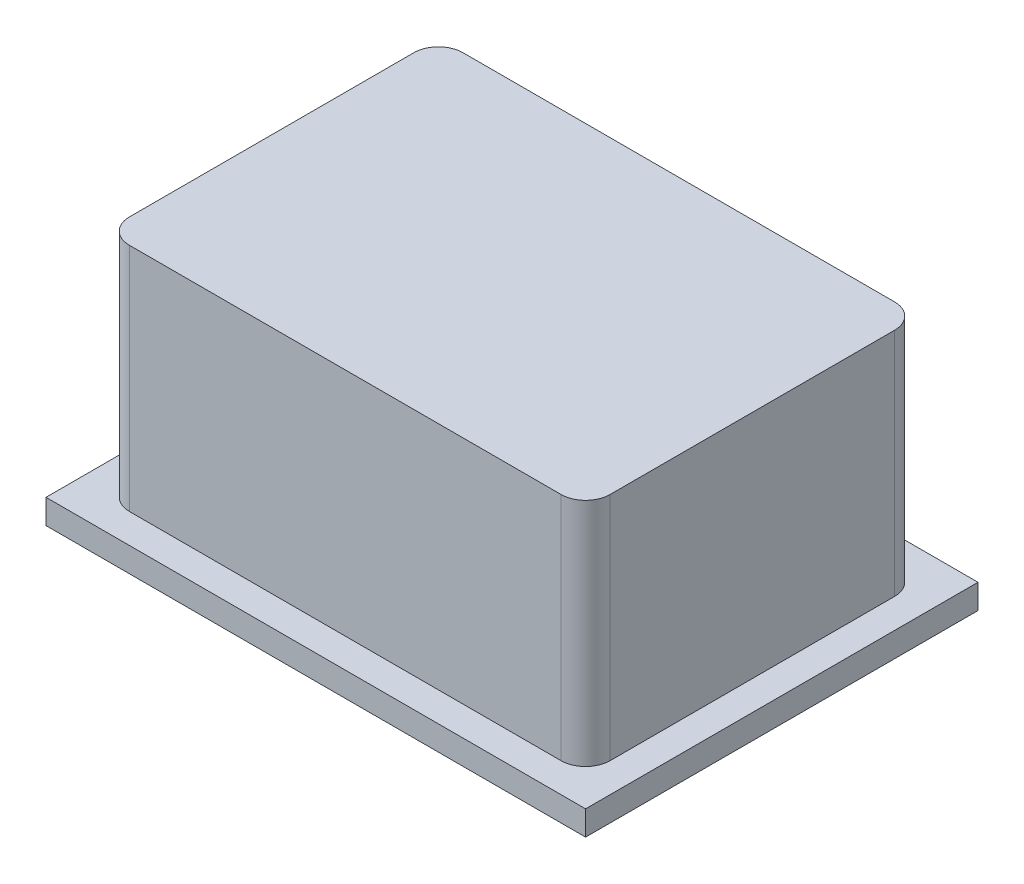
ISO-10303-21;
HEADER;
FILE_DESCRIPTION(('STEP AP214'),'2;1');
FILE_NAME('part.step','',(''),(''),'','','');
FILE_SCHEMA(('AUTOMOTIVE_DESIGN { 1 0 10303 214 1 1 1 1 }'));
ENDSEC;
DATA;
#1=APPLICATION_CONTEXT('core data for automotive mechanical design processes');
#2=APPLICATION_PROTOCOL_DEFINITION('international standard','automotive_design',2000,#1);
#3=PRODUCT_CONTEXT('',#1,'mechanical');
#4=PRODUCT('Part','Part','',(#3));
#5=PRODUCT_RELATED_PRODUCT_CATEGORY('part','',(#4));
#6=PRODUCT_DEFINITION_FORMATION('','',#4);
#7=PRODUCT_DEFINITION_CONTEXT('part definition',#1,'design');
#8=PRODUCT_DEFINITION('design','',#6,#7);
#9=PRODUCT_DEFINITION_SHAPE('','',#8);
#10=(LENGTH_UNIT() NAMED_UNIT(*) SI_UNIT(.MILLI.,.METRE.));
#11=(NAMED_UNIT(*) PLANE_ANGLE_UNIT() SI_UNIT($,.RADIAN.));
#12=(NAMED_UNIT(*) SI_UNIT($,.STERADIAN.) SOLID_ANGLE_UNIT());
#13=UNCERTAINTY_MEASURE_WITH_UNIT(LENGTH_MEASURE(1.E-05),#10,'distance_accuracy_value','');
#14=(GEOMETRIC_REPRESENTATION_CONTEXT(3) GLOBAL_UNCERTAINTY_ASSIGNED_CONTEXT((#13)) GLOBAL_UNIT_ASSIGNED_CONTEXT((#10,
#11,#12)) REPRESENTATION_CONTEXT('',''));
#15=CARTESIAN_POINT('',(0.,0.,0.));
#16=DIRECTION('',(0.,0.,1.));
#17=DIRECTION('',(1.,0.,0.));
#18=AXIS2_PLACEMENT_3D('',#15,#16,#17);
#19=CARTESIAN_POINT('',(0.,4.7,0.));
#20=DIRECTION('',(1.,0.,0.));
#21=DIRECTION('',(0.,0.,-1.));
#22=AXIS2_PLACEMENT_3D('',#19,#20,#21);
#23=PLANE('',#22);
#24=DIRECTION('',(0.,0.,1.));
#25=VECTOR('',#24,1.);
#26=CARTESIAN_POINT('',(0.,4.7,0.));
#27=LINE('',#26,#25);
#28=CARTESIAN_POINT('',(0.,4.7,-6.3));
#29=VERTEX_POINT('',#28);
#30=CARTESIAN_POINT('',(0.,4.7,-0.5));
#31=VERTEX_POINT('',#30);
#32=EDGE_CURVE('E223',#29,#31,#27,.T.);
#33=ORIENTED_EDGE('',*,*,#32,.F.);
#34=DIRECTION('',(0.,-1.,0.));
#35=VECTOR('',#34,1.);
#36=CARTESIAN_POINT('',(0.,4.7,-6.3));
#37=LINE('',#36,#35);
#38=CARTESIAN_POINT('',(0.,0.,-6.3));
#39=VERTEX_POINT('',#38);
#40=EDGE_CURVE('E269',#29,#39,#37,.T.);
#41=ORIENTED_EDGE('',*,*,#40,.T.);
#42=DIRECTION('',(0.,0.,1.));
#43=VECTOR('',#42,1.);
#44=CARTESIAN_POINT('',(0.,0.,0.));
#45=LINE('',#44,#43);
#46=CARTESIAN_POINT('',(0.,0.,-0.5));
#47=VERTEX_POINT('',#46);
#48=EDGE_CURVE('E225',#39,#47,#45,.T.);
#49=ORIENTED_EDGE('',*,*,#48,.T.);
#50=DIRECTION('',(0.,-1.,0.));
#51=VECTOR('',#50,1.);
#52=CARTESIAN_POINT('',(0.,4.7,-0.5));
#53=LINE('',#52,#51);
#54=EDGE_CURVE('E265',#47,#31,#53,.F.);
#55=ORIENTED_EDGE('',*,*,#54,.T.);
#56=EDGE_LOOP('',(#33,#41,#49,#55));
#57=FACE_BOUND('',#56,.T.);
#58=ADVANCED_FACE('F39',(#57),#23,.F.);
#59=CARTESIAN_POINT('',(0.,4.7,0.));
#60=DIRECTION('',(0.,0.,-1.));
#61=DIRECTION('',(-1.,0.,0.));
#62=AXIS2_PLACEMENT_3D('',#59,#60,#61);
#63=PLANE('',#62);
#64=DIRECTION('',(1.,0.,0.));
#65=VECTOR('',#64,1.);
#66=CARTESIAN_POINT('',(0.,0.,0.));
#67=LINE('',#66,#65);
#68=CARTESIAN_POINT('',(0.5,0.,0.));
#69=VERTEX_POINT('',#68);
#70=CARTESIAN_POINT('',(9.3,0.,0.));
#71=VERTEX_POINT('',#70);
#72=EDGE_CURVE('E239',#69,#71,#67,.T.);
#73=ORIENTED_EDGE('',*,*,#72,.T.);
#74=DIRECTION('',(0.,-1.,0.));
#75=VECTOR('',#74,1.);
#76=CARTESIAN_POINT('',(9.3,4.7,0.));
#77=LINE('',#76,#75);
#78=CARTESIAN_POINT('',(9.3,4.7,0.));
#79=VERTEX_POINT('',#78);
#80=EDGE_CURVE('E272',#71,#79,#77,.F.);
#81=ORIENTED_EDGE('',*,*,#80,.T.);
#82=DIRECTION('',(1.,0.,0.));
#83=VECTOR('',#82,1.);
#84=CARTESIAN_POINT('',(0.,4.7,0.));
#85=LINE('',#84,#83);
#86=CARTESIAN_POINT('',(0.5,4.7,0.));
#87=VERTEX_POINT('',#86);
#88=EDGE_CURVE('E227',#87,#79,#85,.T.);
#89=ORIENTED_EDGE('',*,*,#88,.F.);
#90=DIRECTION('',(0.,-1.,0.));
#91=VECTOR('',#90,1.);
#92=CARTESIAN_POINT('',(0.5,4.7,0.));
#93=LINE('',#92,#91);
#94=EDGE_CURVE('E268',#87,#69,#93,.T.);
#95=ORIENTED_EDGE('',*,*,#94,.T.);
#96=EDGE_LOOP('',(#73,#81,#89,#95));
#97=FACE_BOUND('',#96,.T.);
#98=ADVANCED_FACE('F300',(#97),#63,.F.);
#99=CARTESIAN_POINT('',(9.8,4.7,0.));
#100=DIRECTION('',(-1.,0.,0.));
#101=DIRECTION('',(0.,0.,1.));
#102=AXIS2_PLACEMENT_3D('',#99,#100,#101);
#103=PLANE('',#102);
#104=DIRECTION('',(0.,0.,-1.));
#105=VECTOR('',#104,1.);
#106=CARTESIAN_POINT('',(9.8,0.,0.));
#107=LINE('',#106,#105);
#108=CARTESIAN_POINT('',(9.8,0.,-0.5));
#109=VERTEX_POINT('',#108);
#110=CARTESIAN_POINT('',(9.8,0.,-6.3));
#111=VERTEX_POINT('',#110);
#112=EDGE_CURVE('E245',#109,#111,#107,.T.);
#113=ORIENTED_EDGE('',*,*,#112,.T.);
#114=DIRECTION('',(0.,-1.,0.));
#115=VECTOR('',#114,1.);
#116=CARTESIAN_POINT('',(9.8,4.7,-6.3));
#117=LINE('',#116,#115);
#118=CARTESIAN_POINT('',(9.8,4.7,-6.3));
#119=VERTEX_POINT('',#118);
#120=EDGE_CURVE('E251',#111,#119,#117,.F.);
#121=ORIENTED_EDGE('',*,*,#120,.T.);
#122=DIRECTION('',(0.,0.,-1.));
#123=VECTOR('',#122,1.);
#124=CARTESIAN_POINT('',(9.8,4.7,0.));
#125=LINE('',#124,#123);
#126=CARTESIAN_POINT('',(9.8,4.7,-0.5));
#127=VERTEX_POINT('',#126);
#128=EDGE_CURVE('E233',#127,#119,#125,.T.);
#129=ORIENTED_EDGE('',*,*,#128,.F.);
#130=DIRECTION('',(0.,-1.,0.));
#131=VECTOR('',#130,1.);
#132=CARTESIAN_POINT('',(9.8,4.7,-0.5));
#133=LINE('',#132,#131);
#134=EDGE_CURVE('E252',#127,#109,#133,.T.);
#135=ORIENTED_EDGE('',*,*,#134,.T.);
#136=EDGE_LOOP('',(#113,#121,#129,#135));
#137=FACE_BOUND('',#136,.T.);
#138=ADVANCED_FACE('F304',(#137),#103,.F.);
#139=CARTESIAN_POINT('',(0.,4.7,-6.8));
#140=DIRECTION('',(0.,0.,1.));
#141=DIRECTION('',(1.,0.,0.));
#142=AXIS2_PLACEMENT_3D('',#139,#140,#141);
#143=PLANE('',#142);
#144=DIRECTION('',(-1.,0.,0.));
#145=VECTOR('',#144,1.);
#146=CARTESIAN_POINT('',(0.,4.7,-6.8));
#147=LINE('',#146,#145);
#148=CARTESIAN_POINT('',(9.3,4.7,-6.8));
#149=VERTEX_POINT('',#148);
#150=CARTESIAN_POINT('',(0.5,4.7,-6.8));
#151=VERTEX_POINT('',#150);
#152=EDGE_CURVE('E234',#149,#151,#147,.T.);
#153=ORIENTED_EDGE('',*,*,#152,.F.);
#154=DIRECTION('',(0.,-1.,0.));
#155=VECTOR('',#154,1.);
#156=CARTESIAN_POINT('',(9.3,4.7,-6.8));
#157=LINE('',#156,#155);
#158=CARTESIAN_POINT('',(9.3,0.,-6.8));
#159=VERTEX_POINT('',#158);
#160=EDGE_CURVE('E247',#149,#159,#157,.T.);
#161=ORIENTED_EDGE('',*,*,#160,.T.);
#162=DIRECTION('',(-1.,0.,0.));
#163=VECTOR('',#162,1.);
#164=CARTESIAN_POINT('',(0.,0.,-6.8));
#165=LINE('',#164,#163);
#166=CARTESIAN_POINT('',(0.5,0.,-6.8));
#167=VERTEX_POINT('',#166);
#168=EDGE_CURVE('E226',#159,#167,#165,.T.);
#169=ORIENTED_EDGE('',*,*,#168,.T.);
#170=DIRECTION('',(0.,-1.,0.));
#171=VECTOR('',#170,1.);
#172=CARTESIAN_POINT('',(0.5,4.7,-6.8));
#173=LINE('',#172,#171);
#174=EDGE_CURVE('E240',#167,#151,#173,.F.);
#175=ORIENTED_EDGE('',*,*,#174,.T.);
#176=EDGE_LOOP('',(#153,#161,#169,#175));
#177=FACE_BOUND('',#176,.T.);
#178=ADVANCED_FACE('F281',(#177),#143,.F.);
#179=CARTESIAN_POINT('',(0.,4.7,0.));
#180=DIRECTION('',(0.,-1.,0.));
#181=DIRECTION('',(0.,0.,-1.));
#182=AXIS2_PLACEMENT_3D('',#179,#180,#181);
#183=PLANE('',#182);
#184=ORIENTED_EDGE('',*,*,#128,.T.);
#185=CARTESIAN_POINT('',(9.3,4.7,-6.3));
#186=DIRECTION('',(0.,-1.,0.));
#187=DIRECTION('',(0.,0.,-1.));
#188=AXIS2_PLACEMENT_3D('',#185,#186,#187);
#189=CIRCLE('',#188,0.5);
#190=EDGE_CURVE('E264',#119,#149,#189,.F.);
#191=ORIENTED_EDGE('',*,*,#190,.T.);
#192=ORIENTED_EDGE('',*,*,#152,.T.);
#193=CARTESIAN_POINT('',(0.5,4.7,-6.3));
#194=DIRECTION('',(0.,-1.,0.));
#195=DIRECTION('',(0.,0.,-1.));
#196=AXIS2_PLACEMENT_3D('',#193,#194,#195);
#197=CIRCLE('',#196,0.5);
#198=EDGE_CURVE('E258',#151,#29,#197,.F.);
#199=ORIENTED_EDGE('',*,*,#198,.T.);
#200=ORIENTED_EDGE('',*,*,#32,.T.);
#201=CARTESIAN_POINT('',(0.5,4.7,-0.5));
#202=DIRECTION('',(0.,-1.,0.));
#203=DIRECTION('',(0.,0.,-1.));
#204=AXIS2_PLACEMENT_3D('',#201,#202,#203);
#205=CIRCLE('',#204,0.5);
#206=EDGE_CURVE('E257',#31,#87,#205,.F.);
#207=ORIENTED_EDGE('',*,*,#206,.T.);
#208=ORIENTED_EDGE('',*,*,#88,.T.);
#209=CARTESIAN_POINT('',(9.3,4.7,-0.5));
#210=DIRECTION('',(0.,-1.,0.));
#211=DIRECTION('',(0.,0.,-1.));
#212=AXIS2_PLACEMENT_3D('',#209,#210,#211);
#213=CIRCLE('',#212,0.5);
#214=EDGE_CURVE('E259',#79,#127,#213,.F.);
#215=ORIENTED_EDGE('',*,*,#214,.T.);
#216=EDGE_LOOP('',(#184,#191,#192,#199,#200,#207,#208,#215));
#217=FACE_BOUND('',#216,.T.);
#218=ADVANCED_FACE('F293',(#217),#183,.F.);
#219=CARTESIAN_POINT('',(10.4,-0.5,0.6));
#220=DIRECTION('',(0.,0.,-1.));
#221=DIRECTION('',(-1.,0.,0.));
#222=AXIS2_PLACEMENT_3D('',#219,#220,#221);
#223=PLANE('',#222);
#224=DIRECTION('',(-1.,0.,0.));
#225=VECTOR('',#224,1.);
#226=CARTESIAN_POINT('',(10.4,0.,0.6));
#227=LINE('',#226,#225);
#228=CARTESIAN_POINT('',(10.4,0.,0.6));
#229=VERTEX_POINT('',#228);
#230=CARTESIAN_POINT('',(-0.6,0.,0.6));
#231=VERTEX_POINT('',#230);
#232=EDGE_CURVE('E188',#229,#231,#227,.T.);
#233=ORIENTED_EDGE('',*,*,#232,.T.);
#234=DIRECTION('',(0.,1.,0.));
#235=VECTOR('',#234,1.);
#236=CARTESIAN_POINT('',(-0.6,-0.5,0.6));
#237=LINE('',#236,#235);
#238=CARTESIAN_POINT('',(-0.6,-0.5,0.6));
#239=VERTEX_POINT('',#238);
#240=EDGE_CURVE('E216',#239,#231,#237,.T.);
#241=ORIENTED_EDGE('',*,*,#240,.F.);
#242=DIRECTION('',(-1.,0.,0.));
#243=VECTOR('',#242,1.);
#244=CARTESIAN_POINT('',(10.4,-0.5,0.6));
#245=LINE('',#244,#243);
#246=CARTESIAN_POINT('',(10.4,-0.5,0.6));
#247=VERTEX_POINT('',#246);
#248=EDGE_CURVE('E191',#247,#239,#245,.T.);
#249=ORIENTED_EDGE('',*,*,#248,.F.);
#250=DIRECTION('',(0.,1.,0.));
#251=VECTOR('',#250,1.);
#252=CARTESIAN_POINT('',(10.4,-0.5,0.6));
#253=LINE('',#252,#251);
#254=EDGE_CURVE('E203',#247,#229,#253,.T.);
#255=ORIENTED_EDGE('',*,*,#254,.T.);
#256=EDGE_LOOP('',(#233,#241,#249,#255));
#257=FACE_BOUND('',#256,.T.);
#258=ADVANCED_FACE('F334',(#257),#223,.F.);
#259=CARTESIAN_POINT('',(-0.6,-0.5,0.6));
#260=DIRECTION('',(1.,0.,0.));
#261=DIRECTION('',(0.,0.,-1.));
#262=AXIS2_PLACEMENT_3D('',#259,#260,#261);
#263=PLANE('',#262);
#264=DIRECTION('',(0.,0.,-1.));
#265=VECTOR('',#264,1.);
#266=CARTESIAN_POINT('',(-0.6,0.,0.6));
#267=LINE('',#266,#265);
#268=CARTESIAN_POINT('',(-0.6,0.,-7.4));
#269=VERTEX_POINT('',#268);
#270=EDGE_CURVE('E210',#231,#269,#267,.T.);
#271=ORIENTED_EDGE('',*,*,#270,.T.);
#272=DIRECTION('',(0.,1.,0.));
#273=VECTOR('',#272,1.);
#274=CARTESIAN_POINT('',(-0.6,-0.5,-7.4));
#275=LINE('',#274,#273);
#276=CARTESIAN_POINT('',(-0.6,-0.5,-7.4));
#277=VERTEX_POINT('',#276);
#278=EDGE_CURVE('E219',#277,#269,#275,.T.);
#279=ORIENTED_EDGE('',*,*,#278,.F.);
#280=DIRECTION('',(0.,0.,-1.));
#281=VECTOR('',#280,1.);
#282=CARTESIAN_POINT('',(-0.6,-0.5,0.6));
#283=LINE('',#282,#281);
#284=EDGE_CURVE('E199',#239,#277,#283,.T.);
#285=ORIENTED_EDGE('',*,*,#284,.F.);
#286=ORIENTED_EDGE('',*,*,#240,.T.);
#287=EDGE_LOOP('',(#271,#279,#285,#286));
#288=FACE_BOUND('',#287,.T.);
#289=ADVANCED_FACE('F333',(#288),#263,.F.);
#290=CARTESIAN_POINT('',(-0.6,-0.5,-7.4));
#291=DIRECTION('',(0.,0.,1.));
#292=DIRECTION('',(1.,0.,0.));
#293=AXIS2_PLACEMENT_3D('',#290,#291,#292);
#294=PLANE('',#293);
#295=DIRECTION('',(1.,0.,0.));
#296=VECTOR('',#295,1.);
#297=CARTESIAN_POINT('',(-0.6,0.,-7.4));
#298=LINE('',#297,#296);
#299=CARTESIAN_POINT('',(10.4,0.,-7.4));
#300=VERTEX_POINT('',#299);
#301=EDGE_CURVE('E209',#269,#300,#298,.T.);
#302=ORIENTED_EDGE('',*,*,#301,.T.);
#303=DIRECTION('',(0.,1.,0.));
#304=VECTOR('',#303,1.);
#305=CARTESIAN_POINT('',(10.4,-0.5,-7.4));
#306=LINE('',#305,#304);
#307=CARTESIAN_POINT('',(10.4,-0.5,-7.4));
#308=VERTEX_POINT('',#307);
#309=EDGE_CURVE('E211',#308,#300,#306,.T.);
#310=ORIENTED_EDGE('',*,*,#309,.F.);
#311=DIRECTION('',(1.,0.,0.));
#312=VECTOR('',#311,1.);
#313=CARTESIAN_POINT('',(-0.6,-0.5,-7.4));
#314=LINE('',#313,#312);
#315=EDGE_CURVE('E196',#277,#308,#314,.T.);
#316=ORIENTED_EDGE('',*,*,#315,.F.);
#317=ORIENTED_EDGE('',*,*,#278,.T.);
#318=EDGE_LOOP('',(#302,#310,#316,#317));
#319=FACE_BOUND('',#318,.T.);
#320=ADVANCED_FACE('F336',(#319),#294,.F.);
#321=CARTESIAN_POINT('',(10.4,-0.5,-7.4));
#322=DIRECTION('',(-1.,0.,0.));
#323=DIRECTION('',(0.,0.,1.));
#324=AXIS2_PLACEMENT_3D('',#321,#322,#323);
#325=PLANE('',#324);
#326=DIRECTION('',(0.,0.,1.));
#327=VECTOR('',#326,1.);
#328=CARTESIAN_POINT('',(10.4,0.,-7.4));
#329=LINE('',#328,#327);
#330=EDGE_CURVE('E197',#300,#229,#329,.T.);
#331=ORIENTED_EDGE('',*,*,#330,.T.);
#332=ORIENTED_EDGE('',*,*,#254,.F.);
#333=DIRECTION('',(0.,0.,1.));
#334=VECTOR('',#333,1.);
#335=CARTESIAN_POINT('',(10.4,-0.5,-7.4));
#336=LINE('',#335,#334);
#337=EDGE_CURVE('E201',#308,#247,#336,.T.);
#338=ORIENTED_EDGE('',*,*,#337,.F.);
#339=ORIENTED_EDGE('',*,*,#309,.T.);
#340=EDGE_LOOP('',(#331,#332,#338,#339));
#341=FACE_BOUND('',#340,.T.);
#342=ADVANCED_FACE('F345',(#341),#325,.F.);
#343=CARTESIAN_POINT('',(0.,-0.5,0.));
#344=DIRECTION('',(0.,-1.,0.));
#345=DIRECTION('',(0.,0.,-1.));
#346=AXIS2_PLACEMENT_3D('',#343,#344,#345);
#347=PLANE('',#346);
#348=DIRECTION('',(0.,0.,1.));
#349=VECTOR('',#348,1.);
#350=CARTESIAN_POINT('',(8.9,-0.5,-5.9));
#351=LINE('',#350,#349);
#352=CARTESIAN_POINT('',(8.9,-0.5,-5.9));
#353=VERTEX_POINT('',#352);
#354=CARTESIAN_POINT('',(8.9,-0.5,-0.9));
#355=VERTEX_POINT('',#354);
#356=EDGE_CURVE('E160',#353,#355,#351,.T.);
#357=ORIENTED_EDGE('',*,*,#356,.F.);
#358=DIRECTION('',(1.,0.,0.));
#359=VECTOR('',#358,1.);
#360=CARTESIAN_POINT('',(0.9,-0.5,-5.9));
#361=LINE('',#360,#359);
#362=CARTESIAN_POINT('',(0.9,-0.5,-5.9));
#363=VERTEX_POINT('',#362);
#364=EDGE_CURVE('E174',#363,#353,#361,.T.);
#365=ORIENTED_EDGE('',*,*,#364,.F.);
#366=DIRECTION('',(0.,0.,-1.));
#367=VECTOR('',#366,1.);
#368=CARTESIAN_POINT('',(0.9,-0.5,-0.9));
#369=LINE('',#368,#367);
#370=CARTESIAN_POINT('',(0.9,-0.5,-0.9));
#371=VERTEX_POINT('',#370);
#372=EDGE_CURVE('E178',#371,#363,#369,.T.);
#373=ORIENTED_EDGE('',*,*,#372,.F.);
#374=DIRECTION('',(-1.,0.,0.));
#375=VECTOR('',#374,1.);
#376=CARTESIAN_POINT('',(8.9,-0.5,-0.9));
#377=LINE('',#376,#375);
#378=EDGE_CURVE('E183',#355,#371,#377,.T.);
#379=ORIENTED_EDGE('',*,*,#378,.F.);
#380=EDGE_LOOP('',(#357,#365,#373,#379));
#381=FACE_BOUND('',#380,.T.);
#382=ORIENTED_EDGE('',*,*,#248,.T.);
#383=ORIENTED_EDGE('',*,*,#284,.T.);
#384=ORIENTED_EDGE('',*,*,#315,.T.);
#385=ORIENTED_EDGE('',*,*,#337,.T.);
#386=EDGE_LOOP('',(#382,#383,#384,#385));
#387=FACE_BOUND('',#386,.T.);
#388=ADVANCED_FACE('F348',(#381,#387),#347,.T.);
#389=CARTESIAN_POINT('',(0.,0.,0.));
#390=DIRECTION('',(0.,-1.,0.));
#391=DIRECTION('',(0.,0.,-1.));
#392=AXIS2_PLACEMENT_3D('',#389,#390,#391);
#393=PLANE('',#392);
#394=ORIENTED_EDGE('',*,*,#48,.F.);
#395=CARTESIAN_POINT('',(0.5,0.,-6.3));
#396=DIRECTION('',(0.,-1.,0.));
#397=DIRECTION('',(0.,0.,-1.));
#398=AXIS2_PLACEMENT_3D('',#395,#396,#397);
#399=CIRCLE('',#398,0.5);
#400=EDGE_CURVE('E273',#39,#167,#399,.T.);
#401=ORIENTED_EDGE('',*,*,#400,.T.);
#402=ORIENTED_EDGE('',*,*,#168,.F.);
#403=CARTESIAN_POINT('',(9.3,0.,-6.3));
#404=DIRECTION('',(0.,-1.,0.));
#405=DIRECTION('',(0.,0.,-1.));
#406=AXIS2_PLACEMENT_3D('',#403,#404,#405);
#407=CIRCLE('',#406,0.5);
#408=EDGE_CURVE('E271',#159,#111,#407,.T.);
#409=ORIENTED_EDGE('',*,*,#408,.T.);
#410=ORIENTED_EDGE('',*,*,#112,.F.);
#411=CARTESIAN_POINT('',(9.3,0.,-0.5));
#412=DIRECTION('',(0.,-1.,0.));
#413=DIRECTION('',(0.,0.,-1.));
#414=AXIS2_PLACEMENT_3D('',#411,#412,#413);
#415=CIRCLE('',#414,0.5);
#416=EDGE_CURVE('E50',#109,#71,#415,.T.);
#417=ORIENTED_EDGE('',*,*,#416,.T.);
#418=ORIENTED_EDGE('',*,*,#72,.F.);
#419=CARTESIAN_POINT('',(0.5,0.,-0.5));
#420=DIRECTION('',(0.,-1.,0.));
#421=DIRECTION('',(0.,0.,-1.));
#422=AXIS2_PLACEMENT_3D('',#419,#420,#421);
#423=CIRCLE('',#422,0.5);
#424=EDGE_CURVE('E11',#69,#47,#423,.T.);
#425=ORIENTED_EDGE('',*,*,#424,.T.);
#426=EDGE_LOOP('',(#394,#401,#402,#409,#410,#417,#418,#425));
#427=FACE_BOUND('',#426,.T.);
#428=ORIENTED_EDGE('',*,*,#232,.F.);
#429=ORIENTED_EDGE('',*,*,#330,.F.);
#430=ORIENTED_EDGE('',*,*,#301,.F.);
#431=ORIENTED_EDGE('',*,*,#270,.F.);
#432=EDGE_LOOP('',(#428,#429,#430,#431));
#433=FACE_BOUND('',#432,.T.);
#434=ADVANCED_FACE('F279',(#427,#433),#393,.F.);
#435=CARTESIAN_POINT('',(8.9,3.2,-5.9));
#436=DIRECTION('',(1.,0.,0.));
#437=DIRECTION('',(0.,0.,-1.));
#438=AXIS2_PLACEMENT_3D('',#435,#436,#437);
#439=PLANE('',#438);
#440=ORIENTED_EDGE('',*,*,#356,.T.);
#441=DIRECTION('',(0.,-1.,0.));
#442=VECTOR('',#441,1.);
#443=CARTESIAN_POINT('',(8.9,3.2,-0.9));
#444=LINE('',#443,#442);
#445=CARTESIAN_POINT('',(8.9,3.2,-0.9));
#446=VERTEX_POINT('',#445);
#447=EDGE_CURVE('E153',#446,#355,#444,.T.);
#448=ORIENTED_EDGE('',*,*,#447,.F.);
#449=DIRECTION('',(0.,0.,1.));
#450=VECTOR('',#449,1.);
#451=CARTESIAN_POINT('',(8.9,3.2,-5.9));
#452=LINE('',#451,#450);
#453=CARTESIAN_POINT('',(8.9,3.2,-5.9));
#454=VERTEX_POINT('',#453);
#455=EDGE_CURVE('E151',#454,#446,#452,.T.);
#456=ORIENTED_EDGE('',*,*,#455,.F.);
#457=DIRECTION('',(0.,-1.,0.));
#458=VECTOR('',#457,1.);
#459=CARTESIAN_POINT('',(8.9,3.2,-5.9));
#460=LINE('',#459,#458);
#461=EDGE_CURVE('E189',#454,#353,#460,.T.);
#462=ORIENTED_EDGE('',*,*,#461,.T.);
#463=EDGE_LOOP('',(#440,#448,#456,#462));
#464=FACE_BOUND('',#463,.T.);
#465=ADVANCED_FACE('F152',(#464),#439,.F.);
#466=CARTESIAN_POINT('',(0.9,3.2,-5.9));
#467=DIRECTION('',(0.,0.,-1.));
#468=DIRECTION('',(-1.,0.,0.));
#469=AXIS2_PLACEMENT_3D('',#466,#467,#468);
#470=PLANE('',#469);
#471=ORIENTED_EDGE('',*,*,#364,.T.);
#472=ORIENTED_EDGE('',*,*,#461,.F.);
#473=DIRECTION('',(1.,0.,0.));
#474=VECTOR('',#473,1.);
#475=CARTESIAN_POINT('',(0.9,3.2,-5.9));
#476=LINE('',#475,#474);
#477=CARTESIAN_POINT('',(0.9,3.2,-5.9));
#478=VERTEX_POINT('',#477);
#479=EDGE_CURVE('E161',#478,#454,#476,.T.);
#480=ORIENTED_EDGE('',*,*,#479,.F.);
#481=DIRECTION('',(0.,-1.,0.));
#482=VECTOR('',#481,1.);
#483=CARTESIAN_POINT('',(0.9,3.2,-5.9));
#484=LINE('',#483,#482);
#485=EDGE_CURVE('E192',#478,#363,#484,.T.);
#486=ORIENTED_EDGE('',*,*,#485,.T.);
#487=EDGE_LOOP('',(#471,#472,#480,#486));
#488=FACE_BOUND('',#487,.T.);
#489=ADVANCED_FACE('F353',(#488),#470,.F.);
#490=CARTESIAN_POINT('',(0.9,3.2,-0.9));
#491=DIRECTION('',(-1.,0.,0.));
#492=DIRECTION('',(0.,0.,1.));
#493=AXIS2_PLACEMENT_3D('',#490,#491,#492);
#494=PLANE('',#493);
#495=ORIENTED_EDGE('',*,*,#372,.T.);
#496=ORIENTED_EDGE('',*,*,#485,.F.);
#497=DIRECTION('',(0.,0.,-1.));
#498=VECTOR('',#497,1.);
#499=CARTESIAN_POINT('',(0.9,3.2,-0.9));
#500=LINE('',#499,#498);
#501=CARTESIAN_POINT('',(0.9,3.2,-0.9));
#502=VERTEX_POINT('',#501);
#503=EDGE_CURVE('E171',#502,#478,#500,.T.);
#504=ORIENTED_EDGE('',*,*,#503,.F.);
#505=DIRECTION('',(0.,-1.,0.));
#506=VECTOR('',#505,1.);
#507=CARTESIAN_POINT('',(0.9,3.2,-0.9));
#508=LINE('',#507,#506);
#509=EDGE_CURVE('E162',#502,#371,#508,.T.);
#510=ORIENTED_EDGE('',*,*,#509,.T.);
#511=EDGE_LOOP('',(#495,#496,#504,#510));
#512=FACE_BOUND('',#511,.T.);
#513=ADVANCED_FACE('F357',(#512),#494,.F.);
#514=CARTESIAN_POINT('',(8.9,3.2,-0.9));
#515=DIRECTION('',(0.,0.,1.));
#516=DIRECTION('',(1.,0.,0.));
#517=AXIS2_PLACEMENT_3D('',#514,#515,#516);
#518=PLANE('',#517);
#519=ORIENTED_EDGE('',*,*,#378,.T.);
#520=ORIENTED_EDGE('',*,*,#509,.F.);
#521=DIRECTION('',(-1.,0.,0.));
#522=VECTOR('',#521,1.);
#523=CARTESIAN_POINT('',(8.9,3.2,-0.9));
#524=LINE('',#523,#522);
#525=EDGE_CURVE('E168',#446,#502,#524,.T.);
#526=ORIENTED_EDGE('',*,*,#525,.F.);
#527=ORIENTED_EDGE('',*,*,#447,.T.);
#528=EDGE_LOOP('',(#519,#520,#526,#527));
#529=FACE_BOUND('',#528,.T.);
#530=ADVANCED_FACE('F170',(#529),#518,.F.);
#531=CARTESIAN_POINT('',(0.,3.2,0.));
#532=DIRECTION('',(0.,-1.,0.));
#533=DIRECTION('',(0.,0.,-1.));
#534=AXIS2_PLACEMENT_3D('',#531,#532,#533);
#535=PLANE('',#534);
#536=ORIENTED_EDGE('',*,*,#455,.T.);
#537=ORIENTED_EDGE('',*,*,#525,.T.);
#538=ORIENTED_EDGE('',*,*,#503,.T.);
#539=ORIENTED_EDGE('',*,*,#479,.T.);
#540=EDGE_LOOP('',(#536,#537,#538,#539));
#541=FACE_BOUND('',#540,.T.);
#542=ADVANCED_FACE('F173',(#541),#535,.T.);
#543=CARTESIAN_POINT('',(9.3,4.7,-6.3));
#544=DIRECTION('',(0.,-1.,0.));
#545=DIRECTION('',(0.,0.,-1.));
#546=AXIS2_PLACEMENT_3D('',#543,#544,#545);
#547=CYLINDRICAL_SURFACE('',#546,0.5);
#548=ORIENTED_EDGE('',*,*,#190,.F.);
#549=ORIENTED_EDGE('',*,*,#120,.F.);
#550=ORIENTED_EDGE('',*,*,#408,.F.);
#551=ORIENTED_EDGE('',*,*,#160,.F.);
#552=EDGE_LOOP('',(#548,#549,#550,#551));
#553=FACE_BOUND('',#552,.T.);
#554=ADVANCED_FACE('F308',(#553),#547,.T.);
#555=CARTESIAN_POINT('',(0.5,4.7,-6.3));
#556=DIRECTION('',(0.,-1.,0.));
#557=DIRECTION('',(0.,0.,-1.));
#558=AXIS2_PLACEMENT_3D('',#555,#556,#557);
#559=CYLINDRICAL_SURFACE('',#558,0.5);
#560=ORIENTED_EDGE('',*,*,#198,.F.);
#561=ORIENTED_EDGE('',*,*,#174,.F.);
#562=ORIENTED_EDGE('',*,*,#400,.F.);
#563=ORIENTED_EDGE('',*,*,#40,.F.);
#564=EDGE_LOOP('',(#560,#561,#562,#563));
#565=FACE_BOUND('',#564,.T.);
#566=ADVANCED_FACE('F290',(#565),#559,.T.);
#567=CARTESIAN_POINT('',(9.3,4.7,-0.5));
#568=DIRECTION('',(0.,-1.,0.));
#569=DIRECTION('',(0.,0.,-1.));
#570=AXIS2_PLACEMENT_3D('',#567,#568,#569);
#571=CYLINDRICAL_SURFACE('',#570,0.5);
#572=ORIENTED_EDGE('',*,*,#214,.F.);
#573=ORIENTED_EDGE('',*,*,#80,.F.);
#574=ORIENTED_EDGE('',*,*,#416,.F.);
#575=ORIENTED_EDGE('',*,*,#134,.F.);
#576=EDGE_LOOP('',(#572,#573,#574,#575));
#577=FACE_BOUND('',#576,.T.);
#578=ADVANCED_FACE('F297',(#577),#571,.T.);
#579=CARTESIAN_POINT('',(0.5,4.7,-0.5));
#580=DIRECTION('',(0.,-1.,0.));
#581=DIRECTION('',(0.,0.,-1.));
#582=AXIS2_PLACEMENT_3D('',#579,#580,#581);
#583=CYLINDRICAL_SURFACE('',#582,0.5);
#584=ORIENTED_EDGE('',*,*,#206,.F.);
#585=ORIENTED_EDGE('',*,*,#54,.F.);
#586=ORIENTED_EDGE('',*,*,#424,.F.);
#587=ORIENTED_EDGE('',*,*,#94,.F.);
#588=EDGE_LOOP('',(#584,#585,#586,#587));
#589=FACE_BOUND('',#588,.T.);
#590=ADVANCED_FACE('F41',(#589),#583,.T.);
#591=CLOSED_SHELL('',(#58,#98,#138,#178,#218,#258,#289,#320,#342,#388,#434,#465,#489,#513,#530,
#542,#554,#566,#578,#590));
#592=MANIFOLD_SOLID_BREP('B2',#591);
#593=ADVANCED_BREP_SHAPE_REPRESENTATION('',(#18,#592),#14);
#594=SHAPE_DEFINITION_REPRESENTATION(#9,#593);
ENDSEC;
END-ISO-10303-21;
